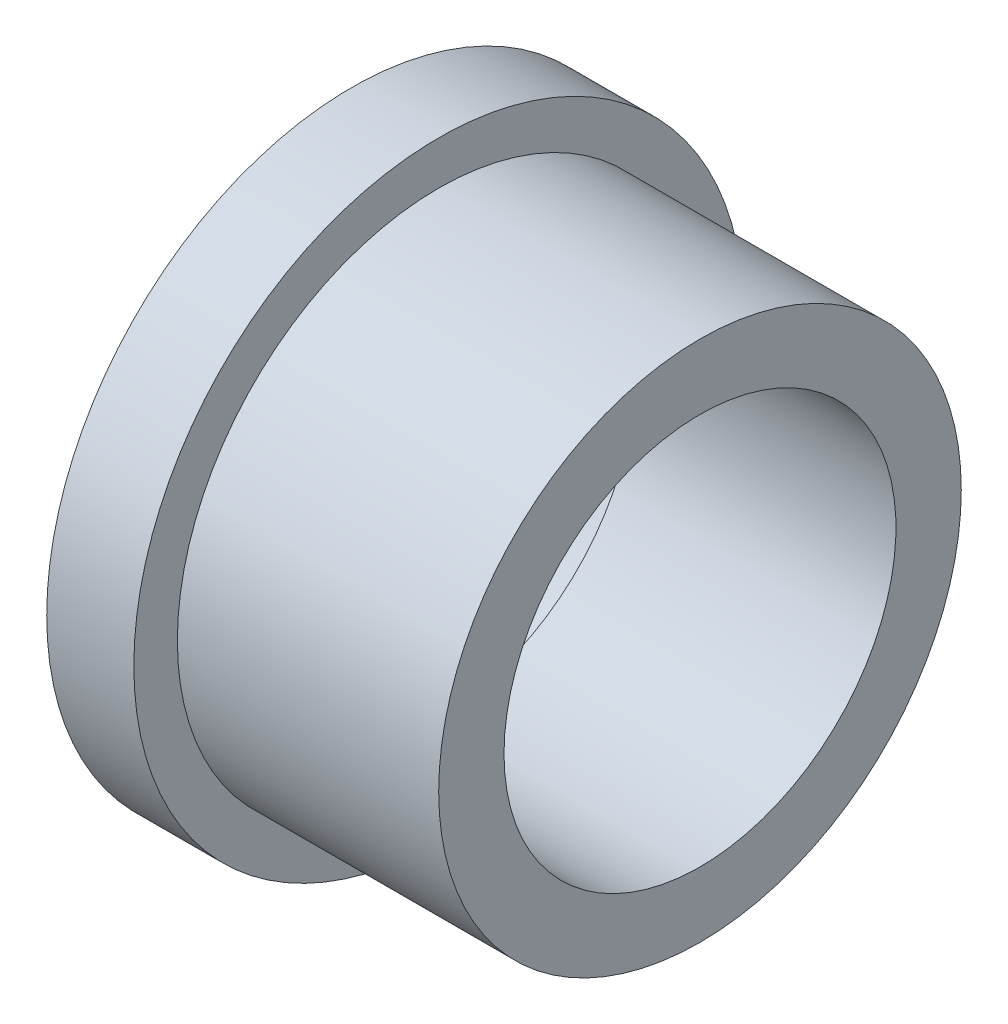
ISO-10303-21;
HEADER;
FILE_DESCRIPTION(('STEP AP214'),'2;1');
FILE_NAME('part.step','',(''),(''),'','','');
FILE_SCHEMA(('AUTOMOTIVE_DESIGN { 1 0 10303 214 1 1 1 1 }'));
ENDSEC;
DATA;
#1=APPLICATION_CONTEXT('core data for automotive mechanical design processes');
#2=APPLICATION_PROTOCOL_DEFINITION('international standard','automotive_design',2000,#1);
#3=PRODUCT_CONTEXT('',#1,'mechanical');
#4=PRODUCT('Part','Part','',(#3));
#5=PRODUCT_RELATED_PRODUCT_CATEGORY('part','',(#4));
#6=PRODUCT_DEFINITION_FORMATION('','',#4);
#7=PRODUCT_DEFINITION_CONTEXT('part definition',#1,'design');
#8=PRODUCT_DEFINITION('design','',#6,#7);
#9=PRODUCT_DEFINITION_SHAPE('','',#8);
#10=(LENGTH_UNIT() NAMED_UNIT(*) SI_UNIT(.MILLI.,.METRE.));
#11=(NAMED_UNIT(*) PLANE_ANGLE_UNIT() SI_UNIT($,.RADIAN.));
#12=(NAMED_UNIT(*) SI_UNIT($,.STERADIAN.) SOLID_ANGLE_UNIT());
#13=UNCERTAINTY_MEASURE_WITH_UNIT(LENGTH_MEASURE(1.E-05),#10,'distance_accuracy_value','');
#14=(GEOMETRIC_REPRESENTATION_CONTEXT(3) GLOBAL_UNCERTAINTY_ASSIGNED_CONTEXT((#13)) GLOBAL_UNIT_ASSIGNED_CONTEXT((#10,
#11,#12)) REPRESENTATION_CONTEXT('',''));
#15=CARTESIAN_POINT('',(0.,0.,0.));
#16=DIRECTION('',(0.,0.,1.));
#17=DIRECTION('',(1.,0.,0.));
#18=AXIS2_PLACEMENT_3D('',#15,#16,#17);
#19=CARTESIAN_POINT('',(0.,0.,0.));
#20=DIRECTION('',(-1.,0.,0.));
#21=DIRECTION('',(0.,0.,1.));
#22=AXIS2_PLACEMENT_3D('',#19,#20,#21);
#23=CYLINDRICAL_SURFACE('',#22,2.1);
#24=CARTESIAN_POINT('',(0.5,0.,0.));
#25=DIRECTION('',(-1.,0.,0.));
#26=DIRECTION('',(0.,0.,1.));
#27=AXIS2_PLACEMENT_3D('',#24,#25,#26);
#28=CIRCLE('',#27,2.1);
#29=CARTESIAN_POINT('',(0.5,0.,2.1));
#30=VERTEX_POINT('',#29);
#31=EDGE_CURVE('E102',#30,#30,#28,.T.);
#32=ORIENTED_EDGE('',*,*,#31,.F.);
#33=EDGE_LOOP('',(#32));
#34=FACE_BOUND('',#33,.T.);
#35=CARTESIAN_POINT('',(0.,0.,0.));
#36=DIRECTION('',(-1.,0.,0.));
#37=DIRECTION('',(0.,0.,1.));
#38=AXIS2_PLACEMENT_3D('',#35,#36,#37);
#39=CIRCLE('',#38,2.1);
#40=CARTESIAN_POINT('',(0.,0.,2.1));
#41=VERTEX_POINT('',#40);
#42=EDGE_CURVE('E12',#41,#41,#39,.T.);
#43=ORIENTED_EDGE('',*,*,#42,.T.);
#44=EDGE_LOOP('',(#43));
#45=FACE_BOUND('',#44,.T.);
#46=ADVANCED_FACE('F55',(#34,#45),#23,.F.);
#47=CARTESIAN_POINT('',(0.,2.1,0.));
#48=DIRECTION('',(1.,0.,0.));
#49=DIRECTION('',(0.,0.,-1.));
#50=AXIS2_PLACEMENT_3D('',#47,#48,#49);
#51=PLANE('',#50);
#52=ORIENTED_EDGE('',*,*,#42,.F.);
#53=EDGE_LOOP('',(#52));
#54=FACE_BOUND('',#53,.T.);
#55=CARTESIAN_POINT('',(0.,0.,0.));
#56=DIRECTION('',(-1.,0.,0.));
#57=DIRECTION('',(0.,0.,1.));
#58=AXIS2_PLACEMENT_3D('',#55,#56,#57);
#59=CIRCLE('',#58,3.5);
#60=CARTESIAN_POINT('',(0.,0.,3.5));
#61=VERTEX_POINT('',#60);
#62=EDGE_CURVE('E62',#61,#61,#59,.T.);
#63=ORIENTED_EDGE('',*,*,#62,.T.);
#64=EDGE_LOOP('',(#63));
#65=FACE_BOUND('',#64,.T.);
#66=ADVANCED_FACE('F112',(#54,#65),#51,.F.);
#67=CARTESIAN_POINT('',(0.,0.,0.));
#68=DIRECTION('',(-1.,0.,0.));
#69=DIRECTION('',(0.,0.,1.));
#70=AXIS2_PLACEMENT_3D('',#67,#68,#69);
#71=CYLINDRICAL_SURFACE('',#70,3.5);
#72=ORIENTED_EDGE('',*,*,#62,.F.);
#73=EDGE_LOOP('',(#72));
#74=FACE_BOUND('',#73,.T.);
#75=CARTESIAN_POINT('',(1.,0.,0.));
#76=DIRECTION('',(-1.,0.,0.));
#77=DIRECTION('',(0.,0.,1.));
#78=AXIS2_PLACEMENT_3D('',#75,#76,#77);
#79=CIRCLE('',#78,3.5);
#80=CARTESIAN_POINT('',(1.,0.,3.5));
#81=VERTEX_POINT('',#80);
#82=EDGE_CURVE('E69',#81,#81,#79,.T.);
#83=ORIENTED_EDGE('',*,*,#82,.T.);
#84=EDGE_LOOP('',(#83));
#85=FACE_BOUND('',#84,.T.);
#86=ADVANCED_FACE('F116',(#74,#85),#71,.T.);
#87=CARTESIAN_POINT('',(1.,3.5,0.));
#88=DIRECTION('',(-1.,0.,0.));
#89=DIRECTION('',(0.,0.,1.));
#90=AXIS2_PLACEMENT_3D('',#87,#88,#89);
#91=PLANE('',#90);
#92=ORIENTED_EDGE('',*,*,#82,.F.);
#93=EDGE_LOOP('',(#92));
#94=FACE_BOUND('',#93,.T.);
#95=CARTESIAN_POINT('',(1.,0.,0.));
#96=DIRECTION('',(-1.,0.,0.));
#97=DIRECTION('',(0.,0.,1.));
#98=AXIS2_PLACEMENT_3D('',#95,#96,#97);
#99=CIRCLE('',#98,3.);
#100=CARTESIAN_POINT('',(1.,0.,3.));
#101=VERTEX_POINT('',#100);
#102=EDGE_CURVE('E76',#101,#101,#99,.T.);
#103=ORIENTED_EDGE('',*,*,#102,.T.);
#104=EDGE_LOOP('',(#103));
#105=FACE_BOUND('',#104,.T.);
#106=ADVANCED_FACE('F121',(#94,#105),#91,.F.);
#107=CARTESIAN_POINT('',(0.,0.,0.));
#108=DIRECTION('',(-1.,0.,0.));
#109=DIRECTION('',(0.,0.,1.));
#110=AXIS2_PLACEMENT_3D('',#107,#108,#109);
#111=CYLINDRICAL_SURFACE('',#110,3.);
#112=ORIENTED_EDGE('',*,*,#102,.F.);
#113=EDGE_LOOP('',(#112));
#114=FACE_BOUND('',#113,.T.);
#115=CARTESIAN_POINT('',(4.,0.,0.));
#116=DIRECTION('',(-1.,0.,0.));
#117=DIRECTION('',(0.,0.,1.));
#118=AXIS2_PLACEMENT_3D('',#115,#116,#117);
#119=CIRCLE('',#118,3.);
#120=CARTESIAN_POINT('',(4.,0.,3.));
#121=VERTEX_POINT('',#120);
#122=EDGE_CURVE('E82',#121,#121,#119,.T.);
#123=ORIENTED_EDGE('',*,*,#122,.T.);
#124=EDGE_LOOP('',(#123));
#125=FACE_BOUND('',#124,.T.);
#126=ADVANCED_FACE('F127',(#114,#125),#111,.T.);
#127=CARTESIAN_POINT('',(4.,3.,0.));
#128=DIRECTION('',(-1.,0.,0.));
#129=DIRECTION('',(0.,0.,1.));
#130=AXIS2_PLACEMENT_3D('',#127,#128,#129);
#131=PLANE('',#130);
#132=ORIENTED_EDGE('',*,*,#122,.F.);
#133=EDGE_LOOP('',(#132));
#134=FACE_BOUND('',#133,.T.);
#135=CARTESIAN_POINT('',(4.,0.,0.));
#136=DIRECTION('',(-1.,0.,0.));
#137=DIRECTION('',(0.,0.,1.));
#138=AXIS2_PLACEMENT_3D('',#135,#136,#137);
#139=CIRCLE('',#138,2.25);
#140=CARTESIAN_POINT('',(4.,0.,2.25));
#141=VERTEX_POINT('',#140);
#142=EDGE_CURVE('E86',#141,#141,#139,.T.);
#143=ORIENTED_EDGE('',*,*,#142,.T.);
#144=EDGE_LOOP('',(#143));
#145=FACE_BOUND('',#144,.T.);
#146=ADVANCED_FACE('F131',(#134,#145),#131,.F.);
#147=CARTESIAN_POINT('',(0.,0.,0.));
#148=DIRECTION('',(-1.,0.,0.));
#149=DIRECTION('',(0.,0.,1.));
#150=AXIS2_PLACEMENT_3D('',#147,#148,#149);
#151=CYLINDRICAL_SURFACE('',#150,2.25);
#152=ORIENTED_EDGE('',*,*,#142,.F.);
#153=EDGE_LOOP('',(#152));
#154=FACE_BOUND('',#153,.T.);
#155=CARTESIAN_POINT('',(1.,0.,0.));
#156=DIRECTION('',(-1.,0.,0.));
#157=DIRECTION('',(0.,0.,1.));
#158=AXIS2_PLACEMENT_3D('',#155,#156,#157);
#159=CIRCLE('',#158,2.25);
#160=CARTESIAN_POINT('',(1.,0.,2.25));
#161=VERTEX_POINT('',#160);
#162=EDGE_CURVE('E90',#161,#161,#159,.T.);
#163=ORIENTED_EDGE('',*,*,#162,.T.);
#164=EDGE_LOOP('',(#163));
#165=FACE_BOUND('',#164,.T.);
#166=ADVANCED_FACE('F135',(#154,#165),#151,.F.);
#167=CARTESIAN_POINT('',(1.,2.25,0.));
#168=DIRECTION('',(1.,0.,0.));
#169=DIRECTION('',(0.,0.,-1.));
#170=AXIS2_PLACEMENT_3D('',#167,#168,#169);
#171=PLANE('',#170);
#172=ORIENTED_EDGE('',*,*,#162,.F.);
#173=EDGE_LOOP('',(#172));
#174=FACE_BOUND('',#173,.T.);
#175=CARTESIAN_POINT('',(1.,0.,0.));
#176=DIRECTION('',(-1.,0.,0.));
#177=DIRECTION('',(0.,0.,1.));
#178=AXIS2_PLACEMENT_3D('',#175,#176,#177);
#179=CIRCLE('',#178,2.6);
#180=CARTESIAN_POINT('',(1.,0.,2.6));
#181=VERTEX_POINT('',#180);
#182=EDGE_CURVE('E94',#181,#181,#179,.T.);
#183=ORIENTED_EDGE('',*,*,#182,.T.);
#184=EDGE_LOOP('',(#183));
#185=FACE_BOUND('',#184,.T.);
#186=ADVANCED_FACE('F139',(#174,#185),#171,.F.);
#187=CARTESIAN_POINT('',(0.,0.,0.));
#188=DIRECTION('',(-1.,0.,0.));
#189=DIRECTION('',(0.,0.,1.));
#190=AXIS2_PLACEMENT_3D('',#187,#188,#189);
#191=CYLINDRICAL_SURFACE('',#190,2.6);
#192=ORIENTED_EDGE('',*,*,#182,.F.);
#193=EDGE_LOOP('',(#192));
#194=FACE_BOUND('',#193,.T.);
#195=CARTESIAN_POINT('',(0.5,0.,0.));
#196=DIRECTION('',(-1.,0.,0.));
#197=DIRECTION('',(0.,0.,1.));
#198=AXIS2_PLACEMENT_3D('',#195,#196,#197);
#199=CIRCLE('',#198,2.6);
#200=CARTESIAN_POINT('',(0.5,0.,2.6));
#201=VERTEX_POINT('',#200);
#202=EDGE_CURVE('E98',#201,#201,#199,.T.);
#203=ORIENTED_EDGE('',*,*,#202,.T.);
#204=EDGE_LOOP('',(#203));
#205=FACE_BOUND('',#204,.T.);
#206=ADVANCED_FACE('F143',(#194,#205),#191,.F.);
#207=CARTESIAN_POINT('',(0.5,2.6,0.));
#208=DIRECTION('',(-1.,0.,0.));
#209=DIRECTION('',(0.,0.,1.));
#210=AXIS2_PLACEMENT_3D('',#207,#208,#209);
#211=PLANE('',#210);
#212=ORIENTED_EDGE('',*,*,#202,.F.);
#213=EDGE_LOOP('',(#212));
#214=FACE_BOUND('',#213,.T.);
#215=ORIENTED_EDGE('',*,*,#31,.T.);
#216=EDGE_LOOP('',(#215));
#217=FACE_BOUND('',#216,.T.);
#218=ADVANCED_FACE('F109',(#214,#217),#211,.F.);
#219=CLOSED_SHELL('',(#46,#66,#86,#106,#126,#146,#166,#186,#206,#218));
#220=MANIFOLD_SOLID_BREP('B2',#219);
#221=ADVANCED_BREP_SHAPE_REPRESENTATION('',(#18,#220),#14);
#222=SHAPE_DEFINITION_REPRESENTATION(#9,#221);
ENDSEC;
END-ISO-10303-21;
